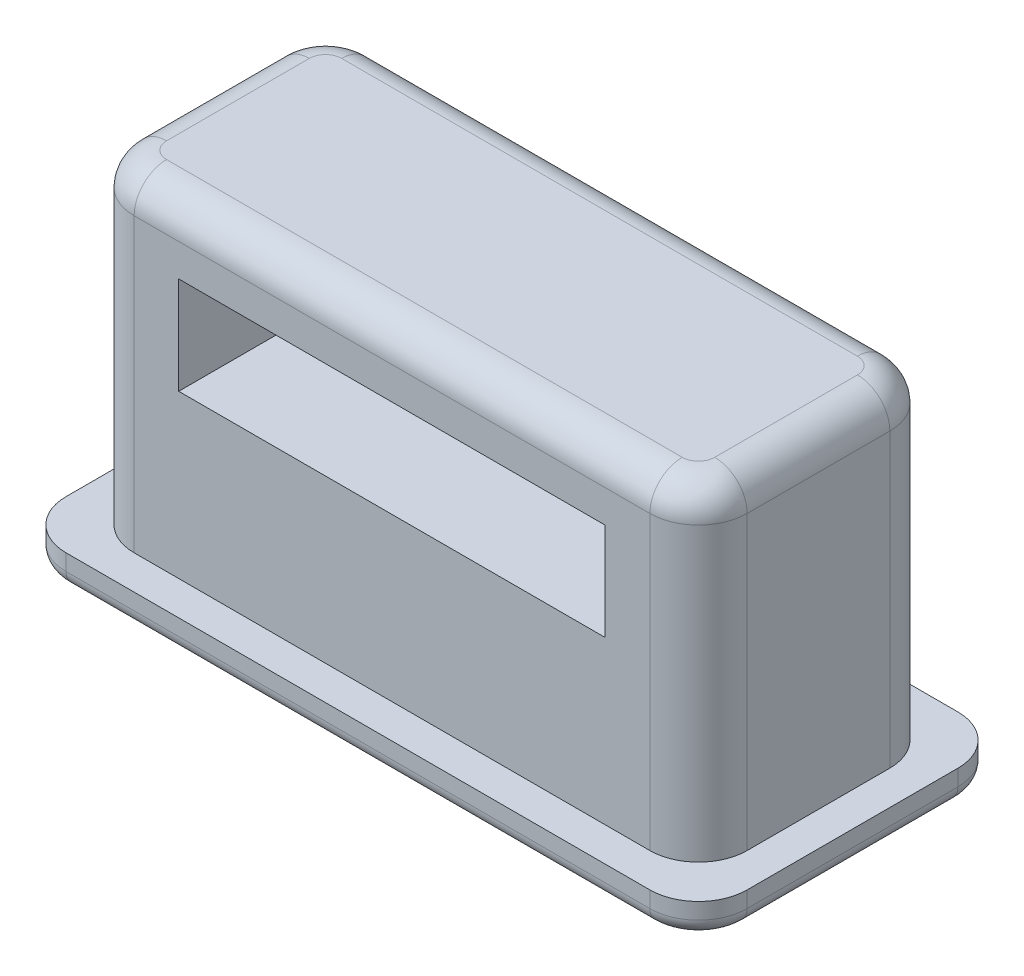
ISO-10303-21;
HEADER;
FILE_DESCRIPTION(('STEP AP214'),'2;1');
FILE_NAME('part.step','',(''),(''),'','','');
FILE_SCHEMA(('AUTOMOTIVE_DESIGN { 1 0 10303 214 1 1 1 1 }'));
ENDSEC;
DATA;
#1=APPLICATION_CONTEXT('core data for automotive mechanical design processes');
#2=APPLICATION_PROTOCOL_DEFINITION('international standard','automotive_design',2000,#1);
#3=PRODUCT_CONTEXT('',#1,'mechanical');
#4=PRODUCT('Part','Part','',(#3));
#5=PRODUCT_RELATED_PRODUCT_CATEGORY('part','',(#4));
#6=PRODUCT_DEFINITION_FORMATION('','',#4);
#7=PRODUCT_DEFINITION_CONTEXT('part definition',#1,'design');
#8=PRODUCT_DEFINITION('design','',#6,#7);
#9=PRODUCT_DEFINITION_SHAPE('','',#8);
#10=(LENGTH_UNIT() NAMED_UNIT(*) SI_UNIT(.MILLI.,.METRE.));
#11=(NAMED_UNIT(*) PLANE_ANGLE_UNIT() SI_UNIT($,.RADIAN.));
#12=(NAMED_UNIT(*) SI_UNIT($,.STERADIAN.) SOLID_ANGLE_UNIT());
#13=UNCERTAINTY_MEASURE_WITH_UNIT(LENGTH_MEASURE(1.E-05),#10,'distance_accuracy_value','');
#14=(GEOMETRIC_REPRESENTATION_CONTEXT(3) GLOBAL_UNCERTAINTY_ASSIGNED_CONTEXT((#13)) GLOBAL_UNIT_ASSIGNED_CONTEXT((#10,
#11,#12)) REPRESENTATION_CONTEXT('',''));
#15=CARTESIAN_POINT('',(0.,0.,0.));
#16=DIRECTION('',(0.,0.,1.));
#17=DIRECTION('',(1.,0.,0.));
#18=AXIS2_PLACEMENT_3D('',#15,#16,#17);
#19=CARTESIAN_POINT('',(-48.897676633875,22.,-13.3605958166485));
#20=DIRECTION('',(-1.,0.,0.));
#21=DIRECTION('',(0.,0.,1.));
#22=AXIS2_PLACEMENT_3D('',#19,#20,#21);
#23=PLANE('',#22);
#24=DIRECTION('',(0.,0.,-1.));
#25=VECTOR('',#24,1.);
#26=CARTESIAN_POINT('',(-48.897676633875,18.,1.43940418335151));
#27=LINE('',#26,#25);
#28=CARTESIAN_POINT('',(-48.897676633875,18.,1.43940418335151));
#29=VERTEX_POINT('',#28);
#30=CARTESIAN_POINT('',(-48.897676633875,18.,-13.3605958166485));
#31=VERTEX_POINT('',#30);
#32=EDGE_CURVE('E241',#29,#31,#27,.T.);
#33=ORIENTED_EDGE('',*,*,#32,.F.);
#34=DIRECTION('',(0.,-1.,0.));
#35=VECTOR('',#34,1.);
#36=CARTESIAN_POINT('',(-48.897676633875,22.,1.43940418335151));
#37=LINE('',#36,#35);
#38=CARTESIAN_POINT('',(-48.897676633875,12.,1.43940418335151));
#39=VERTEX_POINT('',#38);
#40=EDGE_CURVE('E240',#29,#39,#37,.T.);
#41=ORIENTED_EDGE('',*,*,#40,.T.);
#42=DIRECTION('',(0.,0.,-1.));
#43=VECTOR('',#42,1.);
#44=CARTESIAN_POINT('',(-48.897676633875,12.,-13.3605958166485));
#45=LINE('',#44,#43);
#46=CARTESIAN_POINT('',(-48.897676633875,12.,-13.3605958166485));
#47=VERTEX_POINT('',#46);
#48=EDGE_CURVE('E246',#39,#47,#45,.T.);
#49=ORIENTED_EDGE('',*,*,#48,.T.);
#50=DIRECTION('',(0.,-1.,0.));
#51=VECTOR('',#50,1.);
#52=CARTESIAN_POINT('',(-48.897676633875,22.,-13.3605958166485));
#53=LINE('',#52,#51);
#54=EDGE_CURVE('E268',#31,#47,#53,.T.);
#55=ORIENTED_EDGE('',*,*,#54,.F.);
#56=EDGE_LOOP('',(#33,#41,#49,#55));
#57=FACE_BOUND('',#56,.T.);
#58=ADVANCED_FACE('F35',(#57),#23,.F.);
#59=CARTESIAN_POINT('',(-22.597676633875,22.,-13.3605958166485));
#60=DIRECTION('',(1.,0.,0.));
#61=DIRECTION('',(0.,0.,-1.));
#62=AXIS2_PLACEMENT_3D('',#59,#60,#61);
#63=PLANE('',#62);
#64=DIRECTION('',(0.,0.,-1.));
#65=VECTOR('',#64,1.);
#66=CARTESIAN_POINT('',(-22.597676633875,18.,1.43940418335151));
#67=LINE('',#66,#65);
#68=CARTESIAN_POINT('',(-22.597676633875,18.,1.43940418335151));
#69=VERTEX_POINT('',#68);
#70=CARTESIAN_POINT('',(-22.597676633875,18.,-13.3605958166485));
#71=VERTEX_POINT('',#70);
#72=EDGE_CURVE('E221',#69,#71,#67,.T.);
#73=ORIENTED_EDGE('',*,*,#72,.T.);
#74=DIRECTION('',(0.,-1.,0.));
#75=VECTOR('',#74,1.);
#76=CARTESIAN_POINT('',(-22.597676633875,22.,-13.3605958166485));
#77=LINE('',#76,#75);
#78=CARTESIAN_POINT('',(-22.597676633875,12.,-13.3605958166485));
#79=VERTEX_POINT('',#78);
#80=EDGE_CURVE('E247',#71,#79,#77,.T.);
#81=ORIENTED_EDGE('',*,*,#80,.T.);
#82=DIRECTION('',(0.,0.,1.));
#83=VECTOR('',#82,1.);
#84=CARTESIAN_POINT('',(-22.597676633875,12.,-13.3605958166485));
#85=LINE('',#84,#83);
#86=CARTESIAN_POINT('',(-22.597676633875,12.,1.43940418335151));
#87=VERTEX_POINT('',#86);
#88=EDGE_CURVE('E231',#79,#87,#85,.T.);
#89=ORIENTED_EDGE('',*,*,#88,.T.);
#90=DIRECTION('',(0.,-1.,0.));
#91=VECTOR('',#90,1.);
#92=CARTESIAN_POINT('',(-22.597676633875,22.,1.43940418335151));
#93=LINE('',#92,#91);
#94=EDGE_CURVE('E238',#69,#87,#93,.T.);
#95=ORIENTED_EDGE('',*,*,#94,.F.);
#96=EDGE_LOOP('',(#73,#81,#89,#95));
#97=FACE_BOUND('',#96,.T.);
#98=ADVANCED_FACE('F244',(#97),#63,.F.);
#99=CARTESIAN_POINT('',(0.,12.,0.));
#100=DIRECTION('',(0.,1.,0.));
#101=DIRECTION('',(0.,0.,1.));
#102=AXIS2_PLACEMENT_3D('',#99,#100,#101);
#103=PLANE('',#102);
#104=DIRECTION('',(1.,0.,0.));
#105=VECTOR('',#104,1.);
#106=CARTESIAN_POINT('',(-54.647676633875,12.,1.43940418335151));
#107=LINE('',#106,#105);
#108=EDGE_CURVE('E379',#39,#87,#107,.T.);
#109=ORIENTED_EDGE('',*,*,#108,.T.);
#110=ORIENTED_EDGE('',*,*,#88,.F.);
#111=DIRECTION('',(-1.,0.,0.));
#112=VECTOR('',#111,1.);
#113=CARTESIAN_POINT('',(-54.647676633875,12.,-13.3605958166485));
#114=LINE('',#113,#112);
#115=EDGE_CURVE('E264',#79,#47,#114,.T.);
#116=ORIENTED_EDGE('',*,*,#115,.T.);
#117=ORIENTED_EDGE('',*,*,#48,.F.);
#118=EDGE_LOOP('',(#109,#110,#116,#117));
#119=FACE_BOUND('',#118,.T.);
#120=ADVANCED_FACE('F478',(#119),#103,.T.);
#121=CARTESIAN_POINT('',(0.,2.,0.));
#122=DIRECTION('',(0.,1.,0.));
#123=DIRECTION('',(0.,0.,1.));
#124=AXIS2_PLACEMENT_3D('',#121,#122,#123);
#125=PLANE('',#124);
#126=DIRECTION('',(-1.,0.,0.));
#127=VECTOR('',#126,1.);
#128=CARTESIAN_POINT('',(-56.747676633875,2.,-15.4605958166485));
#129=LINE('',#128,#127);
#130=CARTESIAN_POINT('',(-17.747676633875,2.,-15.4605958166485));
#131=VERTEX_POINT('',#130);
#132=CARTESIAN_POINT('',(-53.747676633875,2.,-15.4605958166485));
#133=VERTEX_POINT('',#132);
#134=EDGE_CURVE('E390',#131,#133,#129,.T.);
#135=ORIENTED_EDGE('',*,*,#134,.T.);
#136=CARTESIAN_POINT('',(-53.747676633875,2.,-12.4605958166485));
#137=DIRECTION('',(0.,1.,0.));
#138=DIRECTION('',(0.,0.,1.));
#139=AXIS2_PLACEMENT_3D('',#136,#137,#138);
#140=CIRCLE('',#139,3.);
#141=CARTESIAN_POINT('',(-56.747676633875,2.,-12.4605958166485));
#142=VERTEX_POINT('',#141);
#143=EDGE_CURVE('E409',#133,#142,#140,.T.);
#144=ORIENTED_EDGE('',*,*,#143,.T.);
#145=DIRECTION('',(0.,0.,1.));
#146=VECTOR('',#145,1.);
#147=CARTESIAN_POINT('',(-56.747676633875,2.,-15.4605958166485));
#148=LINE('',#147,#146);
#149=CARTESIAN_POINT('',(-56.747676633875,2.,0.539404183351508));
#150=VERTEX_POINT('',#149);
#151=EDGE_CURVE('E380',#142,#150,#148,.T.);
#152=ORIENTED_EDGE('',*,*,#151,.T.);
#153=CARTESIAN_POINT('',(-53.747676633875,2.,0.539404183351507));
#154=DIRECTION('',(0.,1.,0.));
#155=DIRECTION('',(0.,0.,1.));
#156=AXIS2_PLACEMENT_3D('',#153,#154,#155);
#157=CIRCLE('',#156,3.);
#158=CARTESIAN_POINT('',(-53.747676633875,2.,3.53940418335151));
#159=VERTEX_POINT('',#158);
#160=EDGE_CURVE('E407',#150,#159,#157,.T.);
#161=ORIENTED_EDGE('',*,*,#160,.T.);
#162=DIRECTION('',(1.,0.,0.));
#163=VECTOR('',#162,1.);
#164=CARTESIAN_POINT('',(-56.747676633875,2.,3.53940418335151));
#165=LINE('',#164,#163);
#166=CARTESIAN_POINT('',(-17.747676633875,2.,3.53940418335151));
#167=VERTEX_POINT('',#166);
#168=EDGE_CURVE('E383',#159,#167,#165,.T.);
#169=ORIENTED_EDGE('',*,*,#168,.T.);
#170=CARTESIAN_POINT('',(-17.747676633875,2.,0.539404183351508));
#171=DIRECTION('',(0.,1.,0.));
#172=DIRECTION('',(0.,0.,1.));
#173=AXIS2_PLACEMENT_3D('',#170,#171,#172);
#174=CIRCLE('',#173,3.);
#175=CARTESIAN_POINT('',(-14.747676633875,2.,0.539404183351508));
#176=VERTEX_POINT('',#175);
#177=EDGE_CURVE('E403',#167,#176,#174,.T.);
#178=ORIENTED_EDGE('',*,*,#177,.T.);
#179=DIRECTION('',(0.,0.,-1.));
#180=VECTOR('',#179,1.);
#181=CARTESIAN_POINT('',(-14.747676633875,2.,-15.4605958166485));
#182=LINE('',#181,#180);
#183=CARTESIAN_POINT('',(-14.747676633875,2.,-12.4605958166485));
#184=VERTEX_POINT('',#183);
#185=EDGE_CURVE('E387',#176,#184,#182,.T.);
#186=ORIENTED_EDGE('',*,*,#185,.T.);
#187=CARTESIAN_POINT('',(-17.747676633875,2.,-12.4605958166485));
#188=DIRECTION('',(0.,1.,0.));
#189=DIRECTION('',(0.,0.,1.));
#190=AXIS2_PLACEMENT_3D('',#187,#188,#189);
#191=CIRCLE('',#190,3.);
#192=EDGE_CURVE('E405',#184,#131,#191,.T.);
#193=ORIENTED_EDGE('',*,*,#192,.T.);
#194=EDGE_LOOP('',(#135,#144,#152,#161,#169,#178,#186,#193));
#195=FACE_BOUND('',#194,.T.);
#196=DIRECTION('',(1.,0.,0.));
#197=VECTOR('',#196,1.);
#198=CARTESIAN_POINT('',(-54.647676633875,2.,1.43940418335151));
#199=LINE('',#198,#197);
#200=CARTESIAN_POINT('',(-51.647676633875,2.,1.43940418335151));
#201=VERTEX_POINT('',#200);
#202=CARTESIAN_POINT('',(-19.847676633875,2.,1.43940418335151));
#203=VERTEX_POINT('',#202);
#204=EDGE_CURVE('E367',#201,#203,#199,.T.);
#205=ORIENTED_EDGE('',*,*,#204,.F.);
#206=CARTESIAN_POINT('',(-51.647676633875,2.,-1.56059581664849));
#207=DIRECTION('',(0.,1.,0.));
#208=DIRECTION('',(0.,0.,1.));
#209=AXIS2_PLACEMENT_3D('',#206,#207,#208);
#210=CIRCLE('',#209,3.);
#211=CARTESIAN_POINT('',(-54.647676633875,2.,-1.56059581664849));
#212=VERTEX_POINT('',#211);
#213=EDGE_CURVE('E294',#201,#212,#210,.F.);
#214=ORIENTED_EDGE('',*,*,#213,.T.);
#215=DIRECTION('',(0.,0.,1.));
#216=VECTOR('',#215,1.);
#217=CARTESIAN_POINT('',(-54.647676633875,2.,-13.3605958166485));
#218=LINE('',#217,#216);
#219=CARTESIAN_POINT('',(-54.647676633875,2.,-10.3605958166485));
#220=VERTEX_POINT('',#219);
#221=EDGE_CURVE('E364',#220,#212,#218,.T.);
#222=ORIENTED_EDGE('',*,*,#221,.F.);
#223=CARTESIAN_POINT('',(-51.647676633875,2.,-10.3605958166485));
#224=DIRECTION('',(0.,1.,0.));
#225=DIRECTION('',(0.,0.,1.));
#226=AXIS2_PLACEMENT_3D('',#223,#224,#225);
#227=CIRCLE('',#226,3.);
#228=CARTESIAN_POINT('',(-51.647676633875,2.,-13.3605958166485));
#229=VERTEX_POINT('',#228);
#230=EDGE_CURVE('E292',#220,#229,#227,.F.);
#231=ORIENTED_EDGE('',*,*,#230,.T.);
#232=DIRECTION('',(-1.,0.,0.));
#233=VECTOR('',#232,1.);
#234=CARTESIAN_POINT('',(-54.647676633875,2.,-13.3605958166485));
#235=LINE('',#234,#233);
#236=CARTESIAN_POINT('',(-19.847676633875,2.,-13.3605958166485));
#237=VERTEX_POINT('',#236);
#238=EDGE_CURVE('E376',#237,#229,#235,.T.);
#239=ORIENTED_EDGE('',*,*,#238,.F.);
#240=CARTESIAN_POINT('',(-19.847676633875,2.,-10.3605958166485));
#241=DIRECTION('',(0.,1.,0.));
#242=DIRECTION('',(0.,0.,1.));
#243=AXIS2_PLACEMENT_3D('',#240,#241,#242);
#244=CIRCLE('',#243,3.);
#245=CARTESIAN_POINT('',(-16.847676633875,2.,-10.3605958166485));
#246=VERTEX_POINT('',#245);
#247=EDGE_CURVE('E288',#237,#246,#244,.F.);
#248=ORIENTED_EDGE('',*,*,#247,.T.);
#249=DIRECTION('',(0.,0.,-1.));
#250=VECTOR('',#249,1.);
#251=CARTESIAN_POINT('',(-16.847676633875,2.,-13.3605958166485));
#252=LINE('',#251,#250);
#253=CARTESIAN_POINT('',(-16.847676633875,2.,-1.56059581664849));
#254=VERTEX_POINT('',#253);
#255=EDGE_CURVE('E370',#254,#246,#252,.T.);
#256=ORIENTED_EDGE('',*,*,#255,.F.);
#257=CARTESIAN_POINT('',(-19.847676633875,2.,-1.56059581664849));
#258=DIRECTION('',(0.,1.,0.));
#259=DIRECTION('',(0.,0.,1.));
#260=AXIS2_PLACEMENT_3D('',#257,#258,#259);
#261=CIRCLE('',#260,3.);
#262=EDGE_CURVE('E290',#254,#203,#261,.F.);
#263=ORIENTED_EDGE('',*,*,#262,.T.);
#264=EDGE_LOOP('',(#205,#214,#222,#231,#239,#248,#256,#263));
#265=FACE_BOUND('',#264,.T.);
#266=ADVANCED_FACE('F516',(#195,#265),#125,.T.);
#267=CARTESIAN_POINT('',(-56.747676633875,2.,-15.4605958166485));
#268=DIRECTION('',(1.,0.,0.));
#269=DIRECTION('',(0.,0.,-1.));
#270=AXIS2_PLACEMENT_3D('',#267,#268,#269);
#271=PLANE('',#270);
#272=DIRECTION('',(0.,-1.,0.));
#273=VECTOR('',#272,1.);
#274=CARTESIAN_POINT('',(-56.747676633875,2.,-12.4605958166485));
#275=LINE('',#274,#273);
#276=CARTESIAN_POINT('',(-56.747676633875,1.,-12.4605958166485));
#277=VERTEX_POINT('',#276);
#278=EDGE_CURVE('E395',#142,#277,#275,.T.);
#279=ORIENTED_EDGE('',*,*,#278,.T.);
#280=DIRECTION('',(0.,0.,1.));
#281=VECTOR('',#280,1.);
#282=CARTESIAN_POINT('',(-56.747676633875,1.,-15.4605958166485));
#283=LINE('',#282,#281);
#284=CARTESIAN_POINT('',(-56.747676633875,1.,0.539404183351508));
#285=VERTEX_POINT('',#284);
#286=EDGE_CURVE('E441',#277,#285,#283,.T.);
#287=ORIENTED_EDGE('',*,*,#286,.T.);
#288=DIRECTION('',(0.,-1.,0.));
#289=VECTOR('',#288,1.);
#290=CARTESIAN_POINT('',(-56.747676633875,2.,0.539404183351508));
#291=LINE('',#290,#289);
#292=EDGE_CURVE('E393',#285,#150,#291,.F.);
#293=ORIENTED_EDGE('',*,*,#292,.T.);
#294=ORIENTED_EDGE('',*,*,#151,.F.);
#295=EDGE_LOOP('',(#279,#287,#293,#294));
#296=FACE_BOUND('',#295,.T.);
#297=ADVANCED_FACE('F554',(#296),#271,.F.);
#298=CARTESIAN_POINT('',(-56.747676633875,2.,3.53940418335151));
#299=DIRECTION('',(0.,0.,-1.));
#300=DIRECTION('',(-1.,0.,0.));
#301=AXIS2_PLACEMENT_3D('',#298,#299,#300);
#302=PLANE('',#301);
#303=DIRECTION('',(0.,-1.,0.));
#304=VECTOR('',#303,1.);
#305=CARTESIAN_POINT('',(-53.747676633875,2.,3.53940418335151));
#306=LINE('',#305,#304);
#307=CARTESIAN_POINT('',(-53.747676633875,1.,3.53940418335151));
#308=VERTEX_POINT('',#307);
#309=EDGE_CURVE('E413',#159,#308,#306,.T.);
#310=ORIENTED_EDGE('',*,*,#309,.T.);
#311=DIRECTION('',(1.,0.,0.));
#312=VECTOR('',#311,1.);
#313=CARTESIAN_POINT('',(-56.747676633875,1.,3.53940418335151));
#314=LINE('',#313,#312);
#315=CARTESIAN_POINT('',(-17.747676633875,1.,3.53940418335151));
#316=VERTEX_POINT('',#315);
#317=EDGE_CURVE('E272',#308,#316,#314,.T.);
#318=ORIENTED_EDGE('',*,*,#317,.T.);
#319=DIRECTION('',(0.,-1.,0.));
#320=VECTOR('',#319,1.);
#321=CARTESIAN_POINT('',(-17.747676633875,2.,3.53940418335151));
#322=LINE('',#321,#320);
#323=EDGE_CURVE('E411',#316,#167,#322,.F.);
#324=ORIENTED_EDGE('',*,*,#323,.T.);
#325=ORIENTED_EDGE('',*,*,#168,.F.);
#326=EDGE_LOOP('',(#310,#318,#324,#325));
#327=FACE_BOUND('',#326,.T.);
#328=ADVANCED_FACE('F560',(#327),#302,.F.);
#329=CARTESIAN_POINT('',(-14.747676633875,2.,-15.4605958166485));
#330=DIRECTION('',(-1.,0.,0.));
#331=DIRECTION('',(0.,0.,1.));
#332=AXIS2_PLACEMENT_3D('',#329,#330,#331);
#333=PLANE('',#332);
#334=DIRECTION('',(0.,-1.,0.));
#335=VECTOR('',#334,1.);
#336=CARTESIAN_POINT('',(-14.747676633875,2.,0.539404183351508));
#337=LINE('',#336,#335);
#338=CARTESIAN_POINT('',(-14.747676633875,1.,0.539404183351508));
#339=VERTEX_POINT('',#338);
#340=EDGE_CURVE('E416',#176,#339,#337,.T.);
#341=ORIENTED_EDGE('',*,*,#340,.T.);
#342=DIRECTION('',(0.,0.,-1.));
#343=VECTOR('',#342,1.);
#344=CARTESIAN_POINT('',(-14.747676633875,1.,-15.4605958166485));
#345=LINE('',#344,#343);
#346=CARTESIAN_POINT('',(-14.747676633875,1.,-12.4605958166485));
#347=VERTEX_POINT('',#346);
#348=EDGE_CURVE('E449',#339,#347,#345,.T.);
#349=ORIENTED_EDGE('',*,*,#348,.T.);
#350=DIRECTION('',(0.,-1.,0.));
#351=VECTOR('',#350,1.);
#352=CARTESIAN_POINT('',(-14.747676633875,2.,-12.4605958166485));
#353=LINE('',#352,#351);
#354=EDGE_CURVE('E419',#347,#184,#353,.F.);
#355=ORIENTED_EDGE('',*,*,#354,.T.);
#356=ORIENTED_EDGE('',*,*,#185,.F.);
#357=EDGE_LOOP('',(#341,#349,#355,#356));
#358=FACE_BOUND('',#357,.T.);
#359=ADVANCED_FACE('F572',(#358),#333,.F.);
#360=CARTESIAN_POINT('',(-56.747676633875,2.,-15.4605958166485));
#361=DIRECTION('',(0.,0.,1.));
#362=DIRECTION('',(1.,0.,0.));
#363=AXIS2_PLACEMENT_3D('',#360,#361,#362);
#364=PLANE('',#363);
#365=DIRECTION('',(0.,-1.,0.));
#366=VECTOR('',#365,1.);
#367=CARTESIAN_POINT('',(-17.747676633875,2.,-15.4605958166485));
#368=LINE('',#367,#366);
#369=CARTESIAN_POINT('',(-17.747676633875,1.,-15.4605958166485));
#370=VERTEX_POINT('',#369);
#371=EDGE_CURVE('E398',#131,#370,#368,.T.);
#372=ORIENTED_EDGE('',*,*,#371,.T.);
#373=DIRECTION('',(-1.,0.,0.));
#374=VECTOR('',#373,1.);
#375=CARTESIAN_POINT('',(-56.747676633875,1.,-15.4605958166485));
#376=LINE('',#375,#374);
#377=CARTESIAN_POINT('',(-53.747676633875,1.,-15.4605958166485));
#378=VERTEX_POINT('',#377);
#379=EDGE_CURVE('E445',#370,#378,#376,.T.);
#380=ORIENTED_EDGE('',*,*,#379,.T.);
#381=DIRECTION('',(0.,-1.,0.));
#382=VECTOR('',#381,1.);
#383=CARTESIAN_POINT('',(-53.747676633875,2.,-15.4605958166485));
#384=LINE('',#383,#382);
#385=EDGE_CURVE('E401',#378,#133,#384,.F.);
#386=ORIENTED_EDGE('',*,*,#385,.T.);
#387=ORIENTED_EDGE('',*,*,#134,.F.);
#388=EDGE_LOOP('',(#372,#380,#386,#387));
#389=FACE_BOUND('',#388,.T.);
#390=ADVANCED_FACE('F568',(#389),#364,.F.);
#391=CARTESIAN_POINT('',(0.,0.,0.));
#392=DIRECTION('',(0.,1.,0.));
#393=DIRECTION('',(0.,0.,1.));
#394=AXIS2_PLACEMENT_3D('',#391,#392,#393);
#395=PLANE('',#394);
#396=DIRECTION('',(1.,0.,0.));
#397=VECTOR('',#396,1.);
#398=CARTESIAN_POINT('',(0.,0.,2.53940418335151));
#399=LINE('',#398,#397);
#400=CARTESIAN_POINT('',(-17.747676633875,0.,2.53940418335151));
#401=VERTEX_POINT('',#400);
#402=CARTESIAN_POINT('',(-53.747676633875,0.,2.53940418335151));
#403=VERTEX_POINT('',#402);
#404=EDGE_CURVE('E421',#401,#403,#399,.F.);
#405=ORIENTED_EDGE('',*,*,#404,.T.);
#406=CARTESIAN_POINT('',(-53.747676633875,0.,0.539404183351507));
#407=DIRECTION('',(0.,1.,0.));
#408=DIRECTION('',(0.,0.,1.));
#409=AXIS2_PLACEMENT_3D('',#406,#407,#408);
#410=CIRCLE('',#409,2.);
#411=CARTESIAN_POINT('',(-55.747676633875,0.,0.539404183351508));
#412=VERTEX_POINT('',#411);
#413=EDGE_CURVE('E435',#403,#412,#410,.F.);
#414=ORIENTED_EDGE('',*,*,#413,.T.);
#415=DIRECTION('',(0.,0.,1.));
#416=VECTOR('',#415,1.);
#417=CARTESIAN_POINT('',(-55.747676633875,0.,0.));
#418=LINE('',#417,#416);
#419=CARTESIAN_POINT('',(-55.747676633875,0.,-12.4605958166485));
#420=VERTEX_POINT('',#419);
#421=EDGE_CURVE('E433',#412,#420,#418,.F.);
#422=ORIENTED_EDGE('',*,*,#421,.T.);
#423=CARTESIAN_POINT('',(-53.747676633875,0.,-12.4605958166485));
#424=DIRECTION('',(0.,1.,0.));
#425=DIRECTION('',(0.,0.,1.));
#426=AXIS2_PLACEMENT_3D('',#423,#424,#425);
#427=CIRCLE('',#426,2.);
#428=CARTESIAN_POINT('',(-53.747676633875,0.,-14.4605958166485));
#429=VERTEX_POINT('',#428);
#430=EDGE_CURVE('E431',#420,#429,#427,.F.);
#431=ORIENTED_EDGE('',*,*,#430,.T.);
#432=DIRECTION('',(-1.,0.,0.));
#433=VECTOR('',#432,1.);
#434=CARTESIAN_POINT('',(0.,0.,-14.4605958166485));
#435=LINE('',#434,#433);
#436=CARTESIAN_POINT('',(-17.747676633875,0.,-14.4605958166485));
#437=VERTEX_POINT('',#436);
#438=EDGE_CURVE('E429',#429,#437,#435,.F.);
#439=ORIENTED_EDGE('',*,*,#438,.T.);
#440=CARTESIAN_POINT('',(-17.747676633875,0.,-12.4605958166485));
#441=DIRECTION('',(0.,1.,0.));
#442=DIRECTION('',(0.,0.,1.));
#443=AXIS2_PLACEMENT_3D('',#440,#441,#442);
#444=CIRCLE('',#443,2.);
#445=CARTESIAN_POINT('',(-15.747676633875,0.,-12.4605958166485));
#446=VERTEX_POINT('',#445);
#447=EDGE_CURVE('E427',#437,#446,#444,.F.);
#448=ORIENTED_EDGE('',*,*,#447,.T.);
#449=DIRECTION('',(0.,0.,-1.));
#450=VECTOR('',#449,1.);
#451=CARTESIAN_POINT('',(-15.747676633875,0.,0.));
#452=LINE('',#451,#450);
#453=CARTESIAN_POINT('',(-15.747676633875,0.,0.539404183351508));
#454=VERTEX_POINT('',#453);
#455=EDGE_CURVE('E425',#446,#454,#452,.F.);
#456=ORIENTED_EDGE('',*,*,#455,.T.);
#457=CARTESIAN_POINT('',(-17.747676633875,0.,0.539404183351508));
#458=DIRECTION('',(0.,1.,0.));
#459=DIRECTION('',(0.,0.,1.));
#460=AXIS2_PLACEMENT_3D('',#457,#458,#459);
#461=CIRCLE('',#460,2.);
#462=EDGE_CURVE('E423',#454,#401,#461,.F.);
#463=ORIENTED_EDGE('',*,*,#462,.T.);
#464=EDGE_LOOP('',(#405,#414,#422,#431,#439,#448,#456,#463));
#465=FACE_BOUND('',#464,.T.);
#466=ADVANCED_FACE('F564',(#465),#395,.F.);
#467=CARTESIAN_POINT('',(-53.747676633875,2.,-12.4605958166485));
#468=DIRECTION('',(0.,-1.,0.));
#469=DIRECTION('',(0.,0.,-1.));
#470=AXIS2_PLACEMENT_3D('',#467,#468,#469);
#471=CYLINDRICAL_SURFACE('',#470,3.);
#472=ORIENTED_EDGE('',*,*,#385,.F.);
#473=CARTESIAN_POINT('',(-53.747676633875,1.,-12.4605958166485));
#474=DIRECTION('',(0.,1.,0.));
#475=DIRECTION('',(0.,0.,1.));
#476=AXIS2_PLACEMENT_3D('',#473,#474,#475);
#477=CIRCLE('',#476,3.);
#478=EDGE_CURVE('E443',#378,#277,#477,.T.);
#479=ORIENTED_EDGE('',*,*,#478,.T.);
#480=ORIENTED_EDGE('',*,*,#278,.F.);
#481=ORIENTED_EDGE('',*,*,#143,.F.);
#482=EDGE_LOOP('',(#472,#479,#480,#481));
#483=FACE_BOUND('',#482,.T.);
#484=ADVANCED_FACE('F567',(#483),#471,.T.);
#485=CARTESIAN_POINT('',(-53.747676633875,2.,0.539404183351507));
#486=DIRECTION('',(0.,-1.,0.));
#487=DIRECTION('',(0.,0.,-1.));
#488=AXIS2_PLACEMENT_3D('',#485,#486,#487);
#489=CYLINDRICAL_SURFACE('',#488,3.);
#490=ORIENTED_EDGE('',*,*,#292,.F.);
#491=CARTESIAN_POINT('',(-53.747676633875,1.,0.539404183351507));
#492=DIRECTION('',(0.,1.,0.));
#493=DIRECTION('',(0.,0.,1.));
#494=AXIS2_PLACEMENT_3D('',#491,#492,#493);
#495=CIRCLE('',#494,3.);
#496=EDGE_CURVE('E438',#285,#308,#495,.T.);
#497=ORIENTED_EDGE('',*,*,#496,.T.);
#498=ORIENTED_EDGE('',*,*,#309,.F.);
#499=ORIENTED_EDGE('',*,*,#160,.F.);
#500=EDGE_LOOP('',(#490,#497,#498,#499));
#501=FACE_BOUND('',#500,.T.);
#502=ADVANCED_FACE('F582',(#501),#489,.T.);
#503=CARTESIAN_POINT('',(-17.747676633875,2.,-12.4605958166485));
#504=DIRECTION('',(0.,-1.,0.));
#505=DIRECTION('',(0.,0.,-1.));
#506=AXIS2_PLACEMENT_3D('',#503,#504,#505);
#507=CYLINDRICAL_SURFACE('',#506,3.);
#508=ORIENTED_EDGE('',*,*,#354,.F.);
#509=CARTESIAN_POINT('',(-17.747676633875,1.,-12.4605958166485));
#510=DIRECTION('',(0.,1.,0.));
#511=DIRECTION('',(0.,0.,1.));
#512=AXIS2_PLACEMENT_3D('',#509,#510,#511);
#513=CIRCLE('',#512,3.);
#514=EDGE_CURVE('E447',#347,#370,#513,.T.);
#515=ORIENTED_EDGE('',*,*,#514,.T.);
#516=ORIENTED_EDGE('',*,*,#371,.F.);
#517=ORIENTED_EDGE('',*,*,#192,.F.);
#518=EDGE_LOOP('',(#508,#515,#516,#517));
#519=FACE_BOUND('',#518,.T.);
#520=ADVANCED_FACE('F586',(#519),#507,.T.);
#521=CARTESIAN_POINT('',(-17.747676633875,2.,0.539404183351508));
#522=DIRECTION('',(0.,-1.,0.));
#523=DIRECTION('',(0.,0.,-1.));
#524=AXIS2_PLACEMENT_3D('',#521,#522,#523);
#525=CYLINDRICAL_SURFACE('',#524,3.);
#526=ORIENTED_EDGE('',*,*,#323,.F.);
#527=CARTESIAN_POINT('',(-17.747676633875,1.,0.539404183351508));
#528=DIRECTION('',(0.,1.,0.));
#529=DIRECTION('',(0.,0.,1.));
#530=AXIS2_PLACEMENT_3D('',#527,#528,#529);
#531=CIRCLE('',#530,3.);
#532=EDGE_CURVE('E451',#316,#339,#531,.T.);
#533=ORIENTED_EDGE('',*,*,#532,.T.);
#534=ORIENTED_EDGE('',*,*,#340,.F.);
#535=ORIENTED_EDGE('',*,*,#177,.F.);
#536=EDGE_LOOP('',(#526,#533,#534,#535));
#537=FACE_BOUND('',#536,.T.);
#538=ADVANCED_FACE('F590',(#537),#525,.T.);
#539=CARTESIAN_POINT('',(-17.747676633875,1.,-12.4605958166485));
#540=DIRECTION('',(0.,1.,0.));
#541=DIRECTION('',(0.,0.,1.));
#542=AXIS2_PLACEMENT_3D('',#539,#540,#541);
#543=TOROIDAL_SURFACE('',#542,2.,1.);
#544=CARTESIAN_POINT('',(-17.747676633875,1.,-14.4605958166485));
#545=DIRECTION('',(-1.,0.,0.));
#546=DIRECTION('',(0.,0.,1.));
#547=AXIS2_PLACEMENT_3D('',#544,#545,#546);
#548=CIRCLE('',#547,1.);
#549=EDGE_CURVE('E470',#370,#437,#548,.T.);
#550=ORIENTED_EDGE('',*,*,#549,.F.);
#551=ORIENTED_EDGE('',*,*,#514,.F.);
#552=CARTESIAN_POINT('',(-15.747676633875,1.,-12.4605958166485));
#553=DIRECTION('',(0.,0.,1.));
#554=DIRECTION('',(1.,0.,0.));
#555=AXIS2_PLACEMENT_3D('',#552,#553,#554);
#556=CIRCLE('',#555,1.);
#557=EDGE_CURVE('E384',#446,#347,#556,.T.);
#558=ORIENTED_EDGE('',*,*,#557,.F.);
#559=ORIENTED_EDGE('',*,*,#447,.F.);
#560=EDGE_LOOP('',(#550,#551,#558,#559));
#561=FACE_BOUND('',#560,.T.);
#562=ADVANCED_FACE('F594',(#561),#543,.T.);
#563=CARTESIAN_POINT('',(-15.747676633875,1.,-15.4605958166485));
#564=DIRECTION('',(0.,0.,-1.));
#565=DIRECTION('',(-1.,0.,0.));
#566=AXIS2_PLACEMENT_3D('',#563,#564,#565);
#567=CYLINDRICAL_SURFACE('',#566,1.);
#568=ORIENTED_EDGE('',*,*,#557,.T.);
#569=ORIENTED_EDGE('',*,*,#348,.F.);
#570=CARTESIAN_POINT('',(-15.747676633875,1.,0.539404183351508));
#571=DIRECTION('',(0.,0.,1.));
#572=DIRECTION('',(1.,0.,0.));
#573=AXIS2_PLACEMENT_3D('',#570,#571,#572);
#574=CIRCLE('',#573,1.);
#575=EDGE_CURVE('E467',#454,#339,#574,.T.);
#576=ORIENTED_EDGE('',*,*,#575,.F.);
#577=ORIENTED_EDGE('',*,*,#455,.F.);
#578=EDGE_LOOP('',(#568,#569,#576,#577));
#579=FACE_BOUND('',#578,.T.);
#580=ADVANCED_FACE('F618',(#579),#567,.T.);
#581=CARTESIAN_POINT('',(-56.747676633875,1.,-14.4605958166485));
#582=DIRECTION('',(-1.,0.,0.));
#583=DIRECTION('',(0.,0.,1.));
#584=AXIS2_PLACEMENT_3D('',#581,#582,#583);
#585=CYLINDRICAL_SURFACE('',#584,1.);
#586=ORIENTED_EDGE('',*,*,#549,.T.);
#587=ORIENTED_EDGE('',*,*,#438,.F.);
#588=CARTESIAN_POINT('',(-53.747676633875,1.,-14.4605958166485));
#589=DIRECTION('',(-1.,0.,0.));
#590=DIRECTION('',(0.,0.,1.));
#591=AXIS2_PLACEMENT_3D('',#588,#589,#590);
#592=CIRCLE('',#591,1.);
#593=EDGE_CURVE('E464',#378,#429,#592,.T.);
#594=ORIENTED_EDGE('',*,*,#593,.F.);
#595=ORIENTED_EDGE('',*,*,#379,.F.);
#596=EDGE_LOOP('',(#586,#587,#594,#595));
#597=FACE_BOUND('',#596,.T.);
#598=ADVANCED_FACE('F614',(#597),#585,.T.);
#599=CARTESIAN_POINT('',(-17.747676633875,1.,0.539404183351508));
#600=DIRECTION('',(0.,1.,0.));
#601=DIRECTION('',(0.,0.,1.));
#602=AXIS2_PLACEMENT_3D('',#599,#600,#601);
#603=TOROIDAL_SURFACE('',#602,2.,1.);
#604=ORIENTED_EDGE('',*,*,#575,.T.);
#605=ORIENTED_EDGE('',*,*,#532,.F.);
#606=CARTESIAN_POINT('',(-17.747676633875,1.,2.53940418335151));
#607=DIRECTION('',(-1.,0.,0.));
#608=DIRECTION('',(0.,0.,1.));
#609=AXIS2_PLACEMENT_3D('',#606,#607,#608);
#610=CIRCLE('',#609,1.);
#611=EDGE_CURVE('E461',#401,#316,#610,.T.);
#612=ORIENTED_EDGE('',*,*,#611,.F.);
#613=ORIENTED_EDGE('',*,*,#462,.F.);
#614=EDGE_LOOP('',(#604,#605,#612,#613));
#615=FACE_BOUND('',#614,.T.);
#616=ADVANCED_FACE('F610',(#615),#603,.T.);
#617=CARTESIAN_POINT('',(-53.747676633875,1.,-12.4605958166485));
#618=DIRECTION('',(0.,1.,0.));
#619=DIRECTION('',(0.,0.,1.));
#620=AXIS2_PLACEMENT_3D('',#617,#618,#619);
#621=TOROIDAL_SURFACE('',#620,2.,1.);
#622=ORIENTED_EDGE('',*,*,#593,.T.);
#623=ORIENTED_EDGE('',*,*,#430,.F.);
#624=CARTESIAN_POINT('',(-55.747676633875,1.,-12.4605958166485));
#625=DIRECTION('',(0.,0.,1.));
#626=DIRECTION('',(1.,0.,0.));
#627=AXIS2_PLACEMENT_3D('',#624,#625,#626);
#628=CIRCLE('',#627,1.);
#629=EDGE_CURVE('E458',#277,#420,#628,.T.);
#630=ORIENTED_EDGE('',*,*,#629,.F.);
#631=ORIENTED_EDGE('',*,*,#478,.F.);
#632=EDGE_LOOP('',(#622,#623,#630,#631));
#633=FACE_BOUND('',#632,.T.);
#634=ADVANCED_FACE('F606',(#633),#621,.T.);
#635=CARTESIAN_POINT('',(-56.747676633875,1.,2.53940418335151));
#636=DIRECTION('',(1.,0.,0.));
#637=DIRECTION('',(0.,0.,-1.));
#638=AXIS2_PLACEMENT_3D('',#635,#636,#637);
#639=CYLINDRICAL_SURFACE('',#638,1.);
#640=ORIENTED_EDGE('',*,*,#611,.T.);
#641=ORIENTED_EDGE('',*,*,#317,.F.);
#642=CARTESIAN_POINT('',(-53.747676633875,1.,2.53940418335151));
#643=DIRECTION('',(-1.,0.,0.));
#644=DIRECTION('',(0.,0.,1.));
#645=AXIS2_PLACEMENT_3D('',#642,#643,#644);
#646=CIRCLE('',#645,1.);
#647=EDGE_CURVE('E456',#403,#308,#646,.T.);
#648=ORIENTED_EDGE('',*,*,#647,.F.);
#649=ORIENTED_EDGE('',*,*,#404,.F.);
#650=EDGE_LOOP('',(#640,#641,#648,#649));
#651=FACE_BOUND('',#650,.T.);
#652=ADVANCED_FACE('F602',(#651),#639,.T.);
#653=CARTESIAN_POINT('',(-55.747676633875,1.,-15.4605958166485));
#654=DIRECTION('',(0.,0.,1.));
#655=DIRECTION('',(1.,0.,0.));
#656=AXIS2_PLACEMENT_3D('',#653,#654,#655);
#657=CYLINDRICAL_SURFACE('',#656,1.);
#658=ORIENTED_EDGE('',*,*,#629,.T.);
#659=ORIENTED_EDGE('',*,*,#421,.F.);
#660=CARTESIAN_POINT('',(-55.747676633875,1.,0.539404183351508));
#661=DIRECTION('',(0.,0.,1.));
#662=DIRECTION('',(0.,-1.,0.));
#663=AXIS2_PLACEMENT_3D('',#660,#661,#662);
#664=CIRCLE('',#663,1.);
#665=EDGE_CURVE('E454',#285,#412,#664,.T.);
#666=ORIENTED_EDGE('',*,*,#665,.F.);
#667=ORIENTED_EDGE('',*,*,#286,.F.);
#668=EDGE_LOOP('',(#658,#659,#666,#667));
#669=FACE_BOUND('',#668,.T.);
#670=ADVANCED_FACE('F598',(#669),#657,.T.);
#671=CARTESIAN_POINT('',(-53.747676633875,1.,0.539404183351507));
#672=DIRECTION('',(0.,1.,0.));
#673=DIRECTION('',(0.,0.,1.));
#674=AXIS2_PLACEMENT_3D('',#671,#672,#673);
#675=TOROIDAL_SURFACE('',#674,2.,1.);
#676=ORIENTED_EDGE('',*,*,#647,.T.);
#677=ORIENTED_EDGE('',*,*,#496,.F.);
#678=ORIENTED_EDGE('',*,*,#665,.T.);
#679=ORIENTED_EDGE('',*,*,#413,.F.);
#680=EDGE_LOOP('',(#676,#677,#678,#679));
#681=FACE_BOUND('',#680,.T.);
#682=ADVANCED_FACE('F539',(#681),#675,.T.);
#683=CARTESIAN_POINT('',(-54.647676633875,12.,-13.3605958166485));
#684=DIRECTION('',(1.,0.,0.));
#685=DIRECTION('',(0.,0.,-1.));
#686=AXIS2_PLACEMENT_3D('',#683,#684,#685);
#687=PLANE('',#686);
#688=DIRECTION('',(0.,-1.,0.));
#689=VECTOR('',#688,1.);
#690=CARTESIAN_POINT('',(-54.647676633875,12.,-1.56059581664849));
#691=LINE('',#690,#689);
#692=CARTESIAN_POINT('',(-54.647676633875,20.,-1.56059581664849));
#693=VERTEX_POINT('',#692);
#694=EDGE_CURVE('E284',#212,#693,#691,.F.);
#695=ORIENTED_EDGE('',*,*,#694,.T.);
#696=DIRECTION('',(0.,0.,1.));
#697=VECTOR('',#696,1.);
#698=CARTESIAN_POINT('',(-54.647676633875,20.,-10.3605958166485));
#699=LINE('',#698,#697);
#700=CARTESIAN_POINT('',(-54.647676633875,20.,-10.3605958166485));
#701=VERTEX_POINT('',#700);
#702=EDGE_CURVE('E59',#693,#701,#699,.F.);
#703=ORIENTED_EDGE('',*,*,#702,.T.);
#704=DIRECTION('',(0.,-1.,0.));
#705=VECTOR('',#704,1.);
#706=CARTESIAN_POINT('',(-54.647676633875,12.,-10.3605958166485));
#707=LINE('',#706,#705);
#708=EDGE_CURVE('E286',#701,#220,#707,.T.);
#709=ORIENTED_EDGE('',*,*,#708,.T.);
#710=ORIENTED_EDGE('',*,*,#221,.T.);
#711=EDGE_LOOP('',(#695,#703,#709,#710));
#712=FACE_BOUND('',#711,.T.);
#713=ADVANCED_FACE('F362',(#712),#687,.F.);
#714=CARTESIAN_POINT('',(-54.647676633875,12.,1.43940418335151));
#715=DIRECTION('',(0.,0.,-1.));
#716=DIRECTION('',(-1.,0.,0.));
#717=AXIS2_PLACEMENT_3D('',#714,#715,#716);
#718=PLANE('',#717);
#719=ORIENTED_EDGE('',*,*,#40,.F.);
#720=DIRECTION('',(-1.,0.,0.));
#721=VECTOR('',#720,1.);
#722=CARTESIAN_POINT('',(-7.26666231648557,18.,1.43940418335151));
#723=LINE('',#722,#721);
#724=EDGE_CURVE('E225',#69,#29,#723,.T.);
#725=ORIENTED_EDGE('',*,*,#724,.F.);
#726=ORIENTED_EDGE('',*,*,#94,.T.);
#727=ORIENTED_EDGE('',*,*,#108,.F.);
#728=EDGE_LOOP('',(#719,#725,#726,#727));
#729=FACE_BOUND('',#728,.T.);
#730=DIRECTION('',(0.,-1.,0.));
#731=VECTOR('',#730,1.);
#732=CARTESIAN_POINT('',(-19.847676633875,12.,1.43940418335151));
#733=LINE('',#732,#731);
#734=CARTESIAN_POINT('',(-19.847676633875,20.,1.43940418335151));
#735=VERTEX_POINT('',#734);
#736=EDGE_CURVE('E281',#203,#735,#733,.F.);
#737=ORIENTED_EDGE('',*,*,#736,.T.);
#738=DIRECTION('',(1.,0.,0.));
#739=VECTOR('',#738,1.);
#740=CARTESIAN_POINT('',(-51.647676633875,20.,1.43940418335151));
#741=LINE('',#740,#739);
#742=CARTESIAN_POINT('',(-51.647676633875,20.,1.43940418335151));
#743=VERTEX_POINT('',#742);
#744=EDGE_CURVE('E320',#735,#743,#741,.F.);
#745=ORIENTED_EDGE('',*,*,#744,.T.);
#746=DIRECTION('',(0.,-1.,0.));
#747=VECTOR('',#746,1.);
#748=CARTESIAN_POINT('',(-51.647676633875,12.,1.43940418335151));
#749=LINE('',#748,#747);
#750=EDGE_CURVE('E279',#743,#201,#749,.T.);
#751=ORIENTED_EDGE('',*,*,#750,.T.);
#752=ORIENTED_EDGE('',*,*,#204,.T.);
#753=EDGE_LOOP('',(#737,#745,#751,#752));
#754=FACE_BOUND('',#753,.T.);
#755=ADVANCED_FACE('F235',(#729,#754),#718,.F.);
#756=CARTESIAN_POINT('',(-16.847676633875,12.,-13.3605958166485));
#757=DIRECTION('',(-1.,0.,0.));
#758=DIRECTION('',(0.,0.,1.));
#759=AXIS2_PLACEMENT_3D('',#756,#757,#758);
#760=PLANE('',#759);
#761=DIRECTION('',(0.,-1.,0.));
#762=VECTOR('',#761,1.);
#763=CARTESIAN_POINT('',(-16.847676633875,12.,-10.3605958166485));
#764=LINE('',#763,#762);
#765=CARTESIAN_POINT('',(-16.847676633875,20.,-10.3605958166485));
#766=VERTEX_POINT('',#765);
#767=EDGE_CURVE('E276',#246,#766,#764,.F.);
#768=ORIENTED_EDGE('',*,*,#767,.T.);
#769=DIRECTION('',(0.,0.,-1.));
#770=VECTOR('',#769,1.);
#771=CARTESIAN_POINT('',(-16.847676633875,20.,-1.56059581664849));
#772=LINE('',#771,#770);
#773=CARTESIAN_POINT('',(-16.847676633875,20.,-1.56059581664849));
#774=VERTEX_POINT('',#773);
#775=EDGE_CURVE('E316',#766,#774,#772,.F.);
#776=ORIENTED_EDGE('',*,*,#775,.T.);
#777=DIRECTION('',(0.,-1.,0.));
#778=VECTOR('',#777,1.);
#779=CARTESIAN_POINT('',(-16.847676633875,12.,-1.56059581664849));
#780=LINE('',#779,#778);
#781=EDGE_CURVE('E274',#774,#254,#780,.T.);
#782=ORIENTED_EDGE('',*,*,#781,.T.);
#783=ORIENTED_EDGE('',*,*,#255,.T.);
#784=EDGE_LOOP('',(#768,#776,#782,#783));
#785=FACE_BOUND('',#784,.T.);
#786=ADVANCED_FACE('F488',(#785),#760,.F.);
#787=CARTESIAN_POINT('',(-54.647676633875,12.,-13.3605958166485));
#788=DIRECTION('',(0.,0.,1.));
#789=DIRECTION('',(1.,0.,0.));
#790=AXIS2_PLACEMENT_3D('',#787,#788,#789);
#791=PLANE('',#790);
#792=DIRECTION('',(-1.,0.,0.));
#793=VECTOR('',#792,1.);
#794=CARTESIAN_POINT('',(-7.26666231648557,18.,-13.3605958166485));
#795=LINE('',#794,#793);
#796=EDGE_CURVE('E227',#71,#31,#795,.T.);
#797=ORIENTED_EDGE('',*,*,#796,.T.);
#798=ORIENTED_EDGE('',*,*,#54,.T.);
#799=ORIENTED_EDGE('',*,*,#115,.F.);
#800=ORIENTED_EDGE('',*,*,#80,.F.);
#801=EDGE_LOOP('',(#797,#798,#799,#800));
#802=FACE_BOUND('',#801,.T.);
#803=DIRECTION('',(0.,-1.,0.));
#804=VECTOR('',#803,1.);
#805=CARTESIAN_POINT('',(-51.647676633875,12.,-13.3605958166485));
#806=LINE('',#805,#804);
#807=CARTESIAN_POINT('',(-51.647676633875,20.,-13.3605958166485));
#808=VERTEX_POINT('',#807);
#809=EDGE_CURVE('E269',#229,#808,#806,.F.);
#810=ORIENTED_EDGE('',*,*,#809,.T.);
#811=DIRECTION('',(-1.,0.,0.));
#812=VECTOR('',#811,1.);
#813=CARTESIAN_POINT('',(-19.847676633875,20.,-13.3605958166485));
#814=LINE('',#813,#812);
#815=CARTESIAN_POINT('',(-19.847676633875,20.,-13.3605958166485));
#816=VERTEX_POINT('',#815);
#817=EDGE_CURVE('E11',#808,#816,#814,.F.);
#818=ORIENTED_EDGE('',*,*,#817,.T.);
#819=DIRECTION('',(0.,-1.,0.));
#820=VECTOR('',#819,1.);
#821=CARTESIAN_POINT('',(-19.847676633875,12.,-13.3605958166485));
#822=LINE('',#821,#820);
#823=EDGE_CURVE('E271',#816,#237,#822,.T.);
#824=ORIENTED_EDGE('',*,*,#823,.T.);
#825=ORIENTED_EDGE('',*,*,#238,.T.);
#826=EDGE_LOOP('',(#810,#818,#824,#825));
#827=FACE_BOUND('',#826,.T.);
#828=ADVANCED_FACE('F484',(#802,#827),#791,.F.);
#829=CARTESIAN_POINT('',(0.,22.,0.));
#830=DIRECTION('',(0.,1.,0.));
#831=DIRECTION('',(0.,0.,1.));
#832=AXIS2_PLACEMENT_3D('',#829,#830,#831);
#833=PLANE('',#832);
#834=DIRECTION('',(0.,0.,-1.));
#835=VECTOR('',#834,1.);
#836=CARTESIAN_POINT('',(-18.847676633875,22.,-10.3605958166485));
#837=LINE('',#836,#835);
#838=CARTESIAN_POINT('',(-18.847676633875,22.,-1.56059581664849));
#839=VERTEX_POINT('',#838);
#840=CARTESIAN_POINT('',(-18.847676633875,22.,-10.3605958166485));
#841=VERTEX_POINT('',#840);
#842=EDGE_CURVE('E308',#839,#841,#837,.T.);
#843=ORIENTED_EDGE('',*,*,#842,.T.);
#844=CARTESIAN_POINT('',(-19.847676633875,22.,-10.3605958166485));
#845=DIRECTION('',(0.,1.,0.));
#846=DIRECTION('',(0.,0.,1.));
#847=AXIS2_PLACEMENT_3D('',#844,#845,#846);
#848=CIRCLE('',#847,1.);
#849=CARTESIAN_POINT('',(-19.847676633875,22.,-11.3605958166485));
#850=VERTEX_POINT('',#849);
#851=EDGE_CURVE('E310',#841,#850,#848,.T.);
#852=ORIENTED_EDGE('',*,*,#851,.T.);
#853=DIRECTION('',(-1.,0.,0.));
#854=VECTOR('',#853,1.);
#855=CARTESIAN_POINT('',(-51.647676633875,22.,-11.3605958166485));
#856=LINE('',#855,#854);
#857=CARTESIAN_POINT('',(-51.647676633875,22.,-11.3605958166485));
#858=VERTEX_POINT('',#857);
#859=EDGE_CURVE('E296',#850,#858,#856,.T.);
#860=ORIENTED_EDGE('',*,*,#859,.T.);
#861=CARTESIAN_POINT('',(-51.647676633875,22.,-10.3605958166485));
#862=DIRECTION('',(0.,1.,0.));
#863=DIRECTION('',(0.,0.,1.));
#864=AXIS2_PLACEMENT_3D('',#861,#862,#863);
#865=CIRCLE('',#864,1.);
#866=CARTESIAN_POINT('',(-52.647676633875,22.,-10.3605958166485));
#867=VERTEX_POINT('',#866);
#868=EDGE_CURVE('E298',#858,#867,#865,.T.);
#869=ORIENTED_EDGE('',*,*,#868,.T.);
#870=DIRECTION('',(0.,0.,1.));
#871=VECTOR('',#870,1.);
#872=CARTESIAN_POINT('',(-52.647676633875,22.,-1.56059581664849));
#873=LINE('',#872,#871);
#874=CARTESIAN_POINT('',(-52.647676633875,22.,-1.56059581664849));
#875=VERTEX_POINT('',#874);
#876=EDGE_CURVE('E300',#867,#875,#873,.T.);
#877=ORIENTED_EDGE('',*,*,#876,.T.);
#878=CARTESIAN_POINT('',(-51.647676633875,22.,-1.56059581664849));
#879=DIRECTION('',(0.,1.,0.));
#880=DIRECTION('',(0.,0.,1.));
#881=AXIS2_PLACEMENT_3D('',#878,#879,#880);
#882=CIRCLE('',#881,1.);
#883=CARTESIAN_POINT('',(-51.647676633875,22.,-0.560595816648491));
#884=VERTEX_POINT('',#883);
#885=EDGE_CURVE('E302',#875,#884,#882,.T.);
#886=ORIENTED_EDGE('',*,*,#885,.T.);
#887=DIRECTION('',(1.,0.,0.));
#888=VECTOR('',#887,1.);
#889=CARTESIAN_POINT('',(-19.847676633875,22.,-0.560595816648491));
#890=LINE('',#889,#888);
#891=CARTESIAN_POINT('',(-19.847676633875,22.,-0.560595816648491));
#892=VERTEX_POINT('',#891);
#893=EDGE_CURVE('E304',#884,#892,#890,.T.);
#894=ORIENTED_EDGE('',*,*,#893,.T.);
#895=CARTESIAN_POINT('',(-19.847676633875,22.,-1.56059581664849));
#896=DIRECTION('',(0.,1.,0.));
#897=DIRECTION('',(0.,0.,1.));
#898=AXIS2_PLACEMENT_3D('',#895,#896,#897);
#899=CIRCLE('',#898,1.);
#900=EDGE_CURVE('E306',#892,#839,#899,.T.);
#901=ORIENTED_EDGE('',*,*,#900,.T.);
#902=EDGE_LOOP('',(#843,#852,#860,#869,#877,#886,#894,#901));
#903=FACE_BOUND('',#902,.T.);
#904=ADVANCED_FACE('F487',(#903),#833,.T.);
#905=CARTESIAN_POINT('',(-7.26666231648557,18.,1.43940418335151));
#906=DIRECTION('',(0.,1.,0.));
#907=DIRECTION('',(0.,0.,1.));
#908=AXIS2_PLACEMENT_3D('',#905,#906,#907);
#909=PLANE('',#908);
#910=ORIENTED_EDGE('',*,*,#72,.F.);
#911=ORIENTED_EDGE('',*,*,#724,.T.);
#912=ORIENTED_EDGE('',*,*,#32,.T.);
#913=ORIENTED_EDGE('',*,*,#796,.F.);
#914=EDGE_LOOP('',(#910,#911,#912,#913));
#915=FACE_BOUND('',#914,.T.);
#916=ADVANCED_FACE('F223',(#915),#909,.F.);
#917=CARTESIAN_POINT('',(-19.847676633875,12.,-10.3605958166485));
#918=DIRECTION('',(0.,-1.,0.));
#919=DIRECTION('',(0.,0.,-1.));
#920=AXIS2_PLACEMENT_3D('',#917,#918,#919);
#921=CYLINDRICAL_SURFACE('',#920,3.);
#922=ORIENTED_EDGE('',*,*,#823,.F.);
#923=CARTESIAN_POINT('',(-19.847676633875,20.,-10.3605958166485));
#924=DIRECTION('',(0.,1.,0.));
#925=DIRECTION('',(0.,0.,1.));
#926=AXIS2_PLACEMENT_3D('',#923,#924,#925);
#927=CIRCLE('',#926,3.);
#928=EDGE_CURVE('E313',#816,#766,#927,.F.);
#929=ORIENTED_EDGE('',*,*,#928,.T.);
#930=ORIENTED_EDGE('',*,*,#767,.F.);
#931=ORIENTED_EDGE('',*,*,#247,.F.);
#932=EDGE_LOOP('',(#922,#929,#930,#931));
#933=FACE_BOUND('',#932,.T.);
#934=ADVANCED_FACE('F509',(#933),#921,.T.);
#935=CARTESIAN_POINT('',(-19.847676633875,12.,-1.56059581664849));
#936=DIRECTION('',(0.,-1.,0.));
#937=DIRECTION('',(0.,0.,-1.));
#938=AXIS2_PLACEMENT_3D('',#935,#936,#937);
#939=CYLINDRICAL_SURFACE('',#938,3.);
#940=ORIENTED_EDGE('',*,*,#781,.F.);
#941=CARTESIAN_POINT('',(-19.847676633875,20.,-1.56059581664849));
#942=DIRECTION('',(0.,1.,0.));
#943=DIRECTION('',(0.,0.,1.));
#944=AXIS2_PLACEMENT_3D('',#941,#942,#943);
#945=CIRCLE('',#944,3.);
#946=EDGE_CURVE('E318',#774,#735,#945,.F.);
#947=ORIENTED_EDGE('',*,*,#946,.T.);
#948=ORIENTED_EDGE('',*,*,#736,.F.);
#949=ORIENTED_EDGE('',*,*,#262,.F.);
#950=EDGE_LOOP('',(#940,#947,#948,#949));
#951=FACE_BOUND('',#950,.T.);
#952=ADVANCED_FACE('F531',(#951),#939,.T.);
#953=CARTESIAN_POINT('',(-51.647676633875,12.,-10.3605958166485));
#954=DIRECTION('',(0.,-1.,0.));
#955=DIRECTION('',(0.,0.,-1.));
#956=AXIS2_PLACEMENT_3D('',#953,#954,#955);
#957=CYLINDRICAL_SURFACE('',#956,3.);
#958=ORIENTED_EDGE('',*,*,#708,.F.);
#959=CARTESIAN_POINT('',(-51.647676633875,20.,-10.3605958166485));
#960=DIRECTION('',(0.,1.,0.));
#961=DIRECTION('',(0.,0.,1.));
#962=AXIS2_PLACEMENT_3D('',#959,#960,#961);
#963=CIRCLE('',#962,3.);
#964=EDGE_CURVE('E44',#701,#808,#963,.F.);
#965=ORIENTED_EDGE('',*,*,#964,.T.);
#966=ORIENTED_EDGE('',*,*,#809,.F.);
#967=ORIENTED_EDGE('',*,*,#230,.F.);
#968=EDGE_LOOP('',(#958,#965,#966,#967));
#969=FACE_BOUND('',#968,.T.);
#970=ADVANCED_FACE('F517',(#969),#957,.T.);
#971=CARTESIAN_POINT('',(-51.647676633875,12.,-1.56059581664849));
#972=DIRECTION('',(0.,-1.,0.));
#973=DIRECTION('',(0.,0.,-1.));
#974=AXIS2_PLACEMENT_3D('',#971,#972,#973);
#975=CYLINDRICAL_SURFACE('',#974,3.);
#976=ORIENTED_EDGE('',*,*,#750,.F.);
#977=CARTESIAN_POINT('',(-51.647676633875,20.,-1.56059581664849));
#978=DIRECTION('',(0.,1.,0.));
#979=DIRECTION('',(0.,0.,1.));
#980=AXIS2_PLACEMENT_3D('',#977,#978,#979);
#981=CIRCLE('',#980,3.);
#982=EDGE_CURVE('E322',#743,#693,#981,.F.);
#983=ORIENTED_EDGE('',*,*,#982,.T.);
#984=ORIENTED_EDGE('',*,*,#694,.F.);
#985=ORIENTED_EDGE('',*,*,#213,.F.);
#986=EDGE_LOOP('',(#976,#983,#984,#985));
#987=FACE_BOUND('',#986,.T.);
#988=ADVANCED_FACE('F359',(#987),#975,.T.);
#989=CARTESIAN_POINT('',(-51.647676633875,20.,-1.56059581664849));
#990=DIRECTION('',(0.,1.,0.));
#991=DIRECTION('',(0.,0.,1.));
#992=AXIS2_PLACEMENT_3D('',#989,#990,#991);
#993=DEGENERATE_TOROIDAL_SURFACE('',#992,1.,2.,.T.);
#994=CARTESIAN_POINT('',(-52.647676633875,20.,-1.56059581664849));
#995=DIRECTION('',(0.,0.,-1.));
#996=DIRECTION('',(-1.,0.,0.));
#997=AXIS2_PLACEMENT_3D('',#994,#995,#996);
#998=CIRCLE('',#997,2.);
#999=EDGE_CURVE('E341',#693,#875,#998,.T.);
#1000=ORIENTED_EDGE('',*,*,#999,.F.);
#1001=ORIENTED_EDGE('',*,*,#982,.F.);
#1002=CARTESIAN_POINT('',(-51.647676633875,20.,-0.560595816648491));
#1003=DIRECTION('',(1.,0.,0.));
#1004=DIRECTION('',(0.,0.,-1.));
#1005=AXIS2_PLACEMENT_3D('',#1002,#1003,#1004);
#1006=CIRCLE('',#1005,2.);
#1007=EDGE_CURVE('E39',#884,#743,#1006,.T.);
#1008=ORIENTED_EDGE('',*,*,#1007,.F.);
#1009=ORIENTED_EDGE('',*,*,#885,.F.);
#1010=EDGE_LOOP('',(#1000,#1001,#1008,#1009));
#1011=FACE_BOUND('',#1010,.T.);
#1012=ADVANCED_FACE('F37',(#1011),#993,.T.);
#1013=CARTESIAN_POINT('',(0.,20.,-0.560595816648491));
#1014=DIRECTION('',(-1.,0.,0.));
#1015=DIRECTION('',(0.,0.,1.));
#1016=AXIS2_PLACEMENT_3D('',#1013,#1014,#1015);
#1017=CYLINDRICAL_SURFACE('',#1016,2.);
#1018=ORIENTED_EDGE('',*,*,#1007,.T.);
#1019=ORIENTED_EDGE('',*,*,#744,.F.);
#1020=CARTESIAN_POINT('',(-19.847676633875,20.,-0.560595816648491));
#1021=DIRECTION('',(1.,0.,0.));
#1022=DIRECTION('',(0.,0.,-1.));
#1023=AXIS2_PLACEMENT_3D('',#1020,#1021,#1022);
#1024=CIRCLE('',#1023,2.);
#1025=EDGE_CURVE('E339',#892,#735,#1024,.T.);
#1026=ORIENTED_EDGE('',*,*,#1025,.F.);
#1027=ORIENTED_EDGE('',*,*,#893,.F.);
#1028=EDGE_LOOP('',(#1018,#1019,#1026,#1027));
#1029=FACE_BOUND('',#1028,.T.);
#1030=ADVANCED_FACE('F351',(#1029),#1017,.T.);
#1031=CARTESIAN_POINT('',(-52.647676633875,20.,0.));
#1032=DIRECTION('',(0.,0.,-1.));
#1033=DIRECTION('',(-1.,0.,0.));
#1034=AXIS2_PLACEMENT_3D('',#1031,#1032,#1033);
#1035=CYLINDRICAL_SURFACE('',#1034,2.);
#1036=ORIENTED_EDGE('',*,*,#999,.T.);
#1037=ORIENTED_EDGE('',*,*,#876,.F.);
#1038=CARTESIAN_POINT('',(-52.647676633875,20.,-10.3605958166485));
#1039=DIRECTION('',(0.,0.,-1.));
#1040=DIRECTION('',(-1.,0.,0.));
#1041=AXIS2_PLACEMENT_3D('',#1038,#1039,#1040);
#1042=CIRCLE('',#1041,2.);
#1043=EDGE_CURVE('E336',#701,#867,#1042,.T.);
#1044=ORIENTED_EDGE('',*,*,#1043,.F.);
#1045=ORIENTED_EDGE('',*,*,#702,.F.);
#1046=EDGE_LOOP('',(#1036,#1037,#1044,#1045));
#1047=FACE_BOUND('',#1046,.T.);
#1048=ADVANCED_FACE('F519',(#1047),#1035,.T.);
#1049=CARTESIAN_POINT('',(-19.847676633875,20.,-1.56059581664849));
#1050=DIRECTION('',(0.,1.,0.));
#1051=DIRECTION('',(0.,0.,1.));
#1052=AXIS2_PLACEMENT_3D('',#1049,#1050,#1051);
#1053=DEGENERATE_TOROIDAL_SURFACE('',#1052,1.,2.,.T.);
#1054=ORIENTED_EDGE('',*,*,#1025,.T.);
#1055=ORIENTED_EDGE('',*,*,#946,.F.);
#1056=CARTESIAN_POINT('',(-18.847676633875,20.,-1.56059581664849));
#1057=DIRECTION('',(0.,0.,-1.));
#1058=DIRECTION('',(-1.,0.,0.));
#1059=AXIS2_PLACEMENT_3D('',#1056,#1057,#1058);
#1060=CIRCLE('',#1059,2.);
#1061=EDGE_CURVE('E333',#839,#774,#1060,.T.);
#1062=ORIENTED_EDGE('',*,*,#1061,.F.);
#1063=ORIENTED_EDGE('',*,*,#900,.F.);
#1064=EDGE_LOOP('',(#1054,#1055,#1062,#1063));
#1065=FACE_BOUND('',#1064,.T.);
#1066=ADVANCED_FACE('F528',(#1065),#1053,.T.);
#1067=CARTESIAN_POINT('',(-51.647676633875,20.,-10.3605958166485));
#1068=DIRECTION('',(0.,1.,0.));
#1069=DIRECTION('',(0.,0.,1.));
#1070=AXIS2_PLACEMENT_3D('',#1067,#1068,#1069);
#1071=DEGENERATE_TOROIDAL_SURFACE('',#1070,1.,2.,.T.);
#1072=ORIENTED_EDGE('',*,*,#1043,.T.);
#1073=ORIENTED_EDGE('',*,*,#868,.F.);
#1074=CARTESIAN_POINT('',(-51.647676633875,20.,-11.3605958166485));
#1075=DIRECTION('',(1.,0.,0.));
#1076=DIRECTION('',(0.,0.,-1.));
#1077=AXIS2_PLACEMENT_3D('',#1074,#1075,#1076);
#1078=CIRCLE('',#1077,2.);
#1079=EDGE_CURVE('E330',#808,#858,#1078,.T.);
#1080=ORIENTED_EDGE('',*,*,#1079,.F.);
#1081=ORIENTED_EDGE('',*,*,#964,.F.);
#1082=EDGE_LOOP('',(#1072,#1073,#1080,#1081));
#1083=FACE_BOUND('',#1082,.T.);
#1084=ADVANCED_FACE('F496',(#1083),#1071,.T.);
#1085=CARTESIAN_POINT('',(-18.847676633875,20.,0.));
#1086=DIRECTION('',(0.,0.,1.));
#1087=DIRECTION('',(1.,0.,0.));
#1088=AXIS2_PLACEMENT_3D('',#1085,#1086,#1087);
#1089=CYLINDRICAL_SURFACE('',#1088,2.);
#1090=ORIENTED_EDGE('',*,*,#1061,.T.);
#1091=ORIENTED_EDGE('',*,*,#775,.F.);
#1092=CARTESIAN_POINT('',(-18.847676633875,20.,-10.3605958166485));
#1093=DIRECTION('',(0.,0.,-1.));
#1094=DIRECTION('',(-1.,0.,0.));
#1095=AXIS2_PLACEMENT_3D('',#1092,#1093,#1094);
#1096=CIRCLE('',#1095,2.);
#1097=EDGE_CURVE('E328',#841,#766,#1096,.T.);
#1098=ORIENTED_EDGE('',*,*,#1097,.F.);
#1099=ORIENTED_EDGE('',*,*,#842,.F.);
#1100=EDGE_LOOP('',(#1090,#1091,#1098,#1099));
#1101=FACE_BOUND('',#1100,.T.);
#1102=ADVANCED_FACE('F525',(#1101),#1089,.T.);
#1103=CARTESIAN_POINT('',(0.,20.,-11.3605958166485));
#1104=DIRECTION('',(1.,0.,0.));
#1105=DIRECTION('',(0.,0.,-1.));
#1106=AXIS2_PLACEMENT_3D('',#1103,#1104,#1105);
#1107=CYLINDRICAL_SURFACE('',#1106,2.);
#1108=ORIENTED_EDGE('',*,*,#1079,.T.);
#1109=ORIENTED_EDGE('',*,*,#859,.F.);
#1110=CARTESIAN_POINT('',(-19.847676633875,20.,-11.3605958166485));
#1111=DIRECTION('',(1.,0.,0.));
#1112=DIRECTION('',(0.,0.,-1.));
#1113=AXIS2_PLACEMENT_3D('',#1110,#1111,#1112);
#1114=CIRCLE('',#1113,2.);
#1115=EDGE_CURVE('E326',#816,#850,#1114,.T.);
#1116=ORIENTED_EDGE('',*,*,#1115,.F.);
#1117=ORIENTED_EDGE('',*,*,#817,.F.);
#1118=EDGE_LOOP('',(#1108,#1109,#1116,#1117));
#1119=FACE_BOUND('',#1118,.T.);
#1120=ADVANCED_FACE('F500',(#1119),#1107,.T.);
#1121=CARTESIAN_POINT('',(-19.847676633875,20.,-10.3605958166485));
#1122=DIRECTION('',(0.,1.,0.));
#1123=DIRECTION('',(0.,0.,1.));
#1124=AXIS2_PLACEMENT_3D('',#1121,#1122,#1123);
#1125=DEGENERATE_TOROIDAL_SURFACE('',#1124,1.,2.,.T.);
#1126=ORIENTED_EDGE('',*,*,#1097,.T.);
#1127=ORIENTED_EDGE('',*,*,#928,.F.);
#1128=ORIENTED_EDGE('',*,*,#1115,.T.);
#1129=ORIENTED_EDGE('',*,*,#851,.F.);
#1130=EDGE_LOOP('',(#1126,#1127,#1128,#1129));
#1131=FACE_BOUND('',#1130,.T.);
#1132=ADVANCED_FACE('F504',(#1131),#1125,.T.);
#1133=CLOSED_SHELL('',(#58,#98,#120,#266,#297,#328,#359,#390,#466,#484,#502,#520,#538,#562,#580,
#598,#616,#634,#652,#670,#682,#713,#755,#786,#828,#904,#916,#934,#952,#970,#988,#1012,#1030,
#1048,#1066,#1084,#1102,#1120,#1132));
#1134=MANIFOLD_SOLID_BREP('B2',#1133);
#1135=ADVANCED_BREP_SHAPE_REPRESENTATION('',(#18,#1134),#14);
#1136=SHAPE_DEFINITION_REPRESENTATION(#9,#1135);
ENDSEC;
END-ISO-10303-21;
